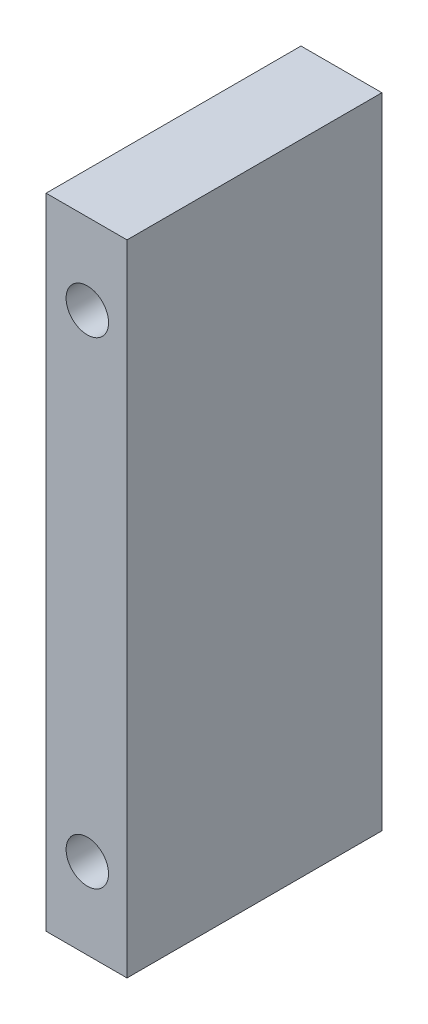
ISO-10303-21;
HEADER;
FILE_DESCRIPTION(('STEP AP214'),'2;1');
FILE_NAME('part.step','',(''),(''),'','','');
FILE_SCHEMA(('AUTOMOTIVE_DESIGN { 1 0 10303 214 1 1 1 1 }'));
ENDSEC;
DATA;
#1=APPLICATION_CONTEXT('core data for automotive mechanical design processes');
#2=APPLICATION_PROTOCOL_DEFINITION('international standard','automotive_design',2000,#1);
#3=PRODUCT_CONTEXT('',#1,'mechanical');
#4=PRODUCT('Part','Part','',(#3));
#5=PRODUCT_RELATED_PRODUCT_CATEGORY('part','',(#4));
#6=PRODUCT_DEFINITION_FORMATION('','',#4);
#7=PRODUCT_DEFINITION_CONTEXT('part definition',#1,'design');
#8=PRODUCT_DEFINITION('design','',#6,#7);
#9=PRODUCT_DEFINITION_SHAPE('','',#8);
#10=(LENGTH_UNIT() NAMED_UNIT(*) SI_UNIT(.MILLI.,.METRE.));
#11=(NAMED_UNIT(*) PLANE_ANGLE_UNIT() SI_UNIT($,.RADIAN.));
#12=(NAMED_UNIT(*) SI_UNIT($,.STERADIAN.) SOLID_ANGLE_UNIT());
#13=UNCERTAINTY_MEASURE_WITH_UNIT(LENGTH_MEASURE(1.E-05),#10,'distance_accuracy_value','');
#14=(GEOMETRIC_REPRESENTATION_CONTEXT(3) GLOBAL_UNCERTAINTY_ASSIGNED_CONTEXT((#13)) GLOBAL_UNIT_ASSIGNED_CONTEXT((#10,
#11,#12)) REPRESENTATION_CONTEXT('',''));
#15=CARTESIAN_POINT('',(0.,0.,0.));
#16=DIRECTION('',(0.,0.,1.));
#17=DIRECTION('',(1.,0.,0.));
#18=AXIS2_PLACEMENT_3D('',#15,#16,#17);
#19=CARTESIAN_POINT('',(0.,0.,25.2));
#20=DIRECTION('',(0.,0.,1.));
#21=DIRECTION('',(1.,0.,0.));
#22=AXIS2_PLACEMENT_3D('',#19,#20,#21);
#23=PLANE('',#22);
#24=CARTESIAN_POINT('',(-3.92428430919329,55.2,25.2));
#25=DIRECTION('',(0.,0.,1.));
#26=DIRECTION('',(1.,0.,0.));
#27=AXIS2_PLACEMENT_3D('',#24,#25,#26);
#28=CIRCLE('',#27,2.1);
#29=CARTESIAN_POINT('',(-1.82428430919329,55.2,25.2));
#30=VERTEX_POINT('',#29);
#31=EDGE_CURVE('E110',#30,#30,#28,.T.);
#32=ORIENTED_EDGE('',*,*,#31,.F.);
#33=EDGE_LOOP('',(#32));
#34=FACE_BOUND('',#33,.T.);
#35=DIRECTION('',(1.,0.,0.));
#36=VECTOR('',#35,1.);
#37=CARTESIAN_POINT('',(-8.,0.,25.2));
#38=LINE('',#37,#36);
#39=CARTESIAN_POINT('',(-8.,0.,25.2));
#40=VERTEX_POINT('',#39);
#41=CARTESIAN_POINT('',(0.,0.,25.2));
#42=VERTEX_POINT('',#41);
#43=EDGE_CURVE('E94',#40,#42,#38,.T.);
#44=ORIENTED_EDGE('',*,*,#43,.T.);
#45=DIRECTION('',(0.,1.,0.));
#46=VECTOR('',#45,1.);
#47=CARTESIAN_POINT('',(0.,0.,25.2));
#48=LINE('',#47,#46);
#49=CARTESIAN_POINT('',(0.,63.2,25.2));
#50=VERTEX_POINT('',#49);
#51=EDGE_CURVE('E89',#42,#50,#48,.T.);
#52=ORIENTED_EDGE('',*,*,#51,.T.);
#53=DIRECTION('',(-1.,0.,0.));
#54=VECTOR('',#53,1.);
#55=CARTESIAN_POINT('',(-8.,63.2,25.2));
#56=LINE('',#55,#54);
#57=CARTESIAN_POINT('',(-8.,63.2,25.2));
#58=VERTEX_POINT('',#57);
#59=EDGE_CURVE('E93',#50,#58,#56,.T.);
#60=ORIENTED_EDGE('',*,*,#59,.T.);
#61=DIRECTION('',(0.,-1.,0.));
#62=VECTOR('',#61,1.);
#63=CARTESIAN_POINT('',(-8.,0.,25.2));
#64=LINE('',#63,#62);
#65=EDGE_CURVE('E58',#58,#40,#64,.T.);
#66=ORIENTED_EDGE('',*,*,#65,.T.);
#67=EDGE_LOOP('',(#44,#52,#60,#66));
#68=FACE_BOUND('',#67,.T.);
#69=CARTESIAN_POINT('',(-3.92428430919329,8.,25.2));
#70=DIRECTION('',(0.,0.,1.));
#71=DIRECTION('',(1.,0.,0.));
#72=AXIS2_PLACEMENT_3D('',#69,#70,#71);
#73=CIRCLE('',#72,2.1);
#74=CARTESIAN_POINT('',(-1.82428430919329,8.,25.2));
#75=VERTEX_POINT('',#74);
#76=EDGE_CURVE('E124',#75,#75,#73,.T.);
#77=ORIENTED_EDGE('',*,*,#76,.F.);
#78=EDGE_LOOP('',(#77));
#79=FACE_BOUND('',#78,.T.);
#80=ADVANCED_FACE('F43',(#34,#68,#79),#23,.T.);
#81=CARTESIAN_POINT('',(0.,0.,0.));
#82=DIRECTION('',(0.,0.,1.));
#83=DIRECTION('',(1.,0.,0.));
#84=AXIS2_PLACEMENT_3D('',#81,#82,#83);
#85=PLANE('',#84);
#86=DIRECTION('',(1.,0.,0.));
#87=VECTOR('',#86,1.);
#88=CARTESIAN_POINT('',(-8.,0.,0.));
#89=LINE('',#88,#87);
#90=CARTESIAN_POINT('',(-8.,0.,0.));
#91=VERTEX_POINT('',#90);
#92=CARTESIAN_POINT('',(0.,0.,0.));
#93=VERTEX_POINT('',#92);
#94=EDGE_CURVE('E107',#91,#93,#89,.T.);
#95=ORIENTED_EDGE('',*,*,#94,.F.);
#96=DIRECTION('',(0.,-1.,0.));
#97=VECTOR('',#96,1.);
#98=CARTESIAN_POINT('',(-8.,0.,0.));
#99=LINE('',#98,#97);
#100=CARTESIAN_POINT('',(-8.,63.2,0.));
#101=VERTEX_POINT('',#100);
#102=EDGE_CURVE('E81',#101,#91,#99,.T.);
#103=ORIENTED_EDGE('',*,*,#102,.F.);
#104=DIRECTION('',(-1.,0.,0.));
#105=VECTOR('',#104,1.);
#106=CARTESIAN_POINT('',(-8.,63.2,0.));
#107=LINE('',#106,#105);
#108=CARTESIAN_POINT('',(0.,63.2,0.));
#109=VERTEX_POINT('',#108);
#110=EDGE_CURVE('E77',#109,#101,#107,.T.);
#111=ORIENTED_EDGE('',*,*,#110,.F.);
#112=DIRECTION('',(0.,1.,0.));
#113=VECTOR('',#112,1.);
#114=CARTESIAN_POINT('',(0.,0.,0.));
#115=LINE('',#114,#113);
#116=EDGE_CURVE('E98',#93,#109,#115,.T.);
#117=ORIENTED_EDGE('',*,*,#116,.F.);
#118=EDGE_LOOP('',(#95,#103,#111,#117));
#119=FACE_BOUND('',#118,.T.);
#120=CARTESIAN_POINT('',(-3.92428430919329,55.2,0.));
#121=DIRECTION('',(0.,0.,1.));
#122=DIRECTION('',(1.,0.,0.));
#123=AXIS2_PLACEMENT_3D('',#120,#121,#122);
#124=CIRCLE('',#123,2.1);
#125=CARTESIAN_POINT('',(-1.82428430919329,55.2,0.));
#126=VERTEX_POINT('',#125);
#127=EDGE_CURVE('E122',#126,#126,#124,.T.);
#128=ORIENTED_EDGE('',*,*,#127,.T.);
#129=EDGE_LOOP('',(#128));
#130=FACE_BOUND('',#129,.T.);
#131=CARTESIAN_POINT('',(-3.92428430919329,8.,0.));
#132=DIRECTION('',(0.,0.,1.));
#133=DIRECTION('',(1.,0.,0.));
#134=AXIS2_PLACEMENT_3D('',#131,#132,#133);
#135=CIRCLE('',#134,2.1);
#136=CARTESIAN_POINT('',(-1.82428430919329,8.,0.));
#137=VERTEX_POINT('',#136);
#138=EDGE_CURVE('E126',#137,#137,#135,.T.);
#139=ORIENTED_EDGE('',*,*,#138,.T.);
#140=EDGE_LOOP('',(#139));
#141=FACE_BOUND('',#140,.T.);
#142=ADVANCED_FACE('F119',(#119,#130,#141),#85,.F.);
#143=CARTESIAN_POINT('',(-8.,0.,25.2));
#144=DIRECTION('',(0.,1.,0.));
#145=DIRECTION('',(-1.,0.,0.));
#146=AXIS2_PLACEMENT_3D('',#143,#144,#145);
#147=PLANE('',#146);
#148=ORIENTED_EDGE('',*,*,#94,.T.);
#149=DIRECTION('',(0.,0.,-1.));
#150=VECTOR('',#149,1.);
#151=CARTESIAN_POINT('',(0.,0.,25.2));
#152=LINE('',#151,#150);
#153=EDGE_CURVE('E11',#42,#93,#152,.T.);
#154=ORIENTED_EDGE('',*,*,#153,.F.);
#155=ORIENTED_EDGE('',*,*,#43,.F.);
#156=DIRECTION('',(0.,0.,-1.));
#157=VECTOR('',#156,1.);
#158=CARTESIAN_POINT('',(-8.,0.,25.2));
#159=LINE('',#158,#157);
#160=EDGE_CURVE('E104',#40,#91,#159,.T.);
#161=ORIENTED_EDGE('',*,*,#160,.T.);
#162=EDGE_LOOP('',(#148,#154,#155,#161));
#163=FACE_BOUND('',#162,.T.);
#164=ADVANCED_FACE('F44',(#163),#147,.F.);
#165=CARTESIAN_POINT('',(0.,0.,25.2));
#166=DIRECTION('',(-1.,0.,0.));
#167=DIRECTION('',(0.,0.,1.));
#168=AXIS2_PLACEMENT_3D('',#165,#166,#167);
#169=PLANE('',#168);
#170=ORIENTED_EDGE('',*,*,#116,.T.);
#171=DIRECTION('',(0.,0.,-1.));
#172=VECTOR('',#171,1.);
#173=CARTESIAN_POINT('',(0.,63.2,25.2));
#174=LINE('',#173,#172);
#175=EDGE_CURVE('E55',#50,#109,#174,.T.);
#176=ORIENTED_EDGE('',*,*,#175,.F.);
#177=ORIENTED_EDGE('',*,*,#51,.F.);
#178=ORIENTED_EDGE('',*,*,#153,.T.);
#179=EDGE_LOOP('',(#170,#176,#177,#178));
#180=FACE_BOUND('',#179,.T.);
#181=ADVANCED_FACE('F97',(#180),#169,.F.);
#182=CARTESIAN_POINT('',(-8.,63.2,25.2));
#183=DIRECTION('',(0.,-1.,0.));
#184=DIRECTION('',(0.,0.,-1.));
#185=AXIS2_PLACEMENT_3D('',#182,#183,#184);
#186=PLANE('',#185);
#187=ORIENTED_EDGE('',*,*,#110,.T.);
#188=DIRECTION('',(0.,0.,-1.));
#189=VECTOR('',#188,1.);
#190=CARTESIAN_POINT('',(-8.,63.2,25.2));
#191=LINE('',#190,#189);
#192=EDGE_CURVE('E99',#58,#101,#191,.T.);
#193=ORIENTED_EDGE('',*,*,#192,.F.);
#194=ORIENTED_EDGE('',*,*,#59,.F.);
#195=ORIENTED_EDGE('',*,*,#175,.T.);
#196=EDGE_LOOP('',(#187,#193,#194,#195));
#197=FACE_BOUND('',#196,.T.);
#198=ADVANCED_FACE('F102',(#197),#186,.F.);
#199=CARTESIAN_POINT('',(-8.,0.,25.2));
#200=DIRECTION('',(1.,0.,0.));
#201=DIRECTION('',(0.,0.,-1.));
#202=AXIS2_PLACEMENT_3D('',#199,#200,#201);
#203=PLANE('',#202);
#204=ORIENTED_EDGE('',*,*,#102,.T.);
#205=ORIENTED_EDGE('',*,*,#160,.F.);
#206=ORIENTED_EDGE('',*,*,#65,.F.);
#207=ORIENTED_EDGE('',*,*,#192,.T.);
#208=EDGE_LOOP('',(#204,#205,#206,#207));
#209=FACE_BOUND('',#208,.T.);
#210=ADVANCED_FACE('F113',(#209),#203,.F.);
#211=CARTESIAN_POINT('',(-3.92428430919329,55.2,25.2));
#212=DIRECTION('',(0.,0.,-1.));
#213=DIRECTION('',(-1.,0.,0.));
#214=AXIS2_PLACEMENT_3D('',#211,#212,#213);
#215=CYLINDRICAL_SURFACE('',#214,2.1);
#216=ORIENTED_EDGE('',*,*,#31,.T.);
#217=EDGE_LOOP('',(#216));
#218=FACE_BOUND('',#217,.T.);
#219=ORIENTED_EDGE('',*,*,#127,.F.);
#220=EDGE_LOOP('',(#219));
#221=FACE_BOUND('',#220,.T.);
#222=ADVANCED_FACE('F144',(#218,#221),#215,.F.);
#223=CARTESIAN_POINT('',(-3.92428430919329,8.,25.2));
#224=DIRECTION('',(0.,0.,-1.));
#225=DIRECTION('',(-1.,0.,0.));
#226=AXIS2_PLACEMENT_3D('',#223,#224,#225);
#227=CYLINDRICAL_SURFACE('',#226,2.1);
#228=ORIENTED_EDGE('',*,*,#76,.T.);
#229=EDGE_LOOP('',(#228));
#230=FACE_BOUND('',#229,.T.);
#231=ORIENTED_EDGE('',*,*,#138,.F.);
#232=EDGE_LOOP('',(#231));
#233=FACE_BOUND('',#232,.T.);
#234=ADVANCED_FACE('F132',(#230,#233),#227,.F.);
#235=CLOSED_SHELL('',(#80,#142,#164,#181,#198,#210,#222,#234));
#236=MANIFOLD_SOLID_BREP('B2',#235);
#237=ADVANCED_BREP_SHAPE_REPRESENTATION('',(#18,#236),#14);
#238=SHAPE_DEFINITION_REPRESENTATION(#9,#237);
ENDSEC;
END-ISO-10303-21;
